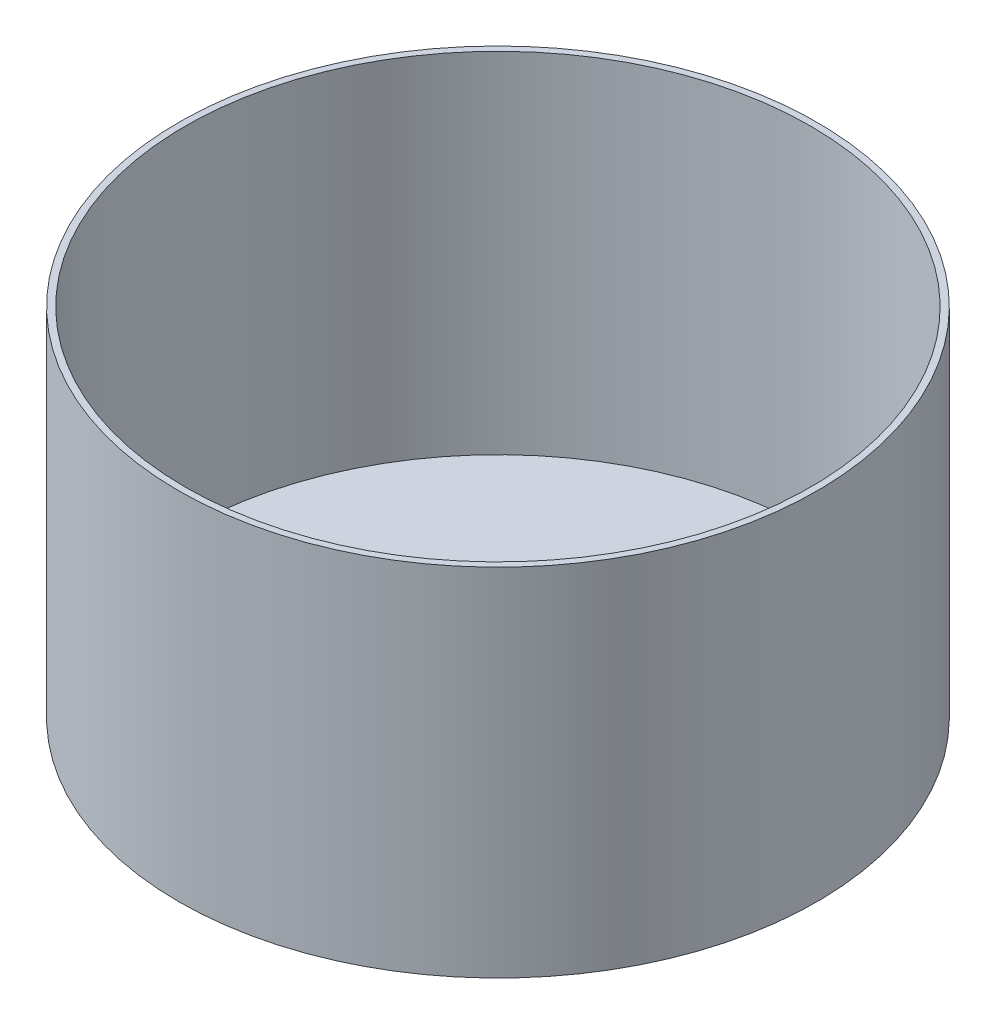
ISO-10303-21;
HEADER;
FILE_DESCRIPTION(('STEP AP214'),'2;1');
FILE_NAME('part.step','',(''),(''),'','','');
FILE_SCHEMA(('AUTOMOTIVE_DESIGN { 1 0 10303 214 1 1 1 1 }'));
ENDSEC;
DATA;
#1=APPLICATION_CONTEXT('core data for automotive mechanical design processes');
#2=APPLICATION_PROTOCOL_DEFINITION('international standard','automotive_design',2000,#1);
#3=PRODUCT_CONTEXT('',#1,'mechanical');
#4=PRODUCT('Part','Part','',(#3));
#5=PRODUCT_RELATED_PRODUCT_CATEGORY('part','',(#4));
#6=PRODUCT_DEFINITION_FORMATION('','',#4);
#7=PRODUCT_DEFINITION_CONTEXT('part definition',#1,'design');
#8=PRODUCT_DEFINITION('design','',#6,#7);
#9=PRODUCT_DEFINITION_SHAPE('','',#8);
#10=(LENGTH_UNIT() NAMED_UNIT(*) SI_UNIT(.MILLI.,.METRE.));
#11=(NAMED_UNIT(*) PLANE_ANGLE_UNIT() SI_UNIT($,.RADIAN.));
#12=(NAMED_UNIT(*) SI_UNIT($,.STERADIAN.) SOLID_ANGLE_UNIT());
#13=UNCERTAINTY_MEASURE_WITH_UNIT(LENGTH_MEASURE(1.E-05),#10,'distance_accuracy_value','');
#14=(GEOMETRIC_REPRESENTATION_CONTEXT(3) GLOBAL_UNCERTAINTY_ASSIGNED_CONTEXT((#13)) GLOBAL_UNIT_ASSIGNED_CONTEXT((#10,
#11,#12)) REPRESENTATION_CONTEXT('',''));
#15=CARTESIAN_POINT('',(0.,0.,0.));
#16=DIRECTION('',(0.,0.,1.));
#17=DIRECTION('',(1.,0.,0.));
#18=AXIS2_PLACEMENT_3D('',#15,#16,#17);
#19=CARTESIAN_POINT('',(0.,3.,0.));
#20=DIRECTION('',(0.,1.,0.));
#21=DIRECTION('',(0.,0.,1.));
#22=AXIS2_PLACEMENT_3D('',#19,#20,#21);
#23=PLANE('',#22);
#24=CARTESIAN_POINT('',(0.,3.,0.));
#25=DIRECTION('',(0.,1.,0.));
#26=DIRECTION('',(0.,0.,1.));
#27=AXIS2_PLACEMENT_3D('',#24,#25,#26);
#28=CIRCLE('',#27,65.);
#29=CARTESIAN_POINT('',(0.,3.,65.));
#30=VERTEX_POINT('',#29);
#31=EDGE_CURVE('E52',#30,#30,#28,.T.);
#32=ORIENTED_EDGE('',*,*,#31,.F.);
#33=EDGE_LOOP('',(#32));
#34=FACE_BOUND('',#33,.T.);
#35=CARTESIAN_POINT('',(0.,3.,0.));
#36=DIRECTION('',(0.,1.,0.));
#37=DIRECTION('',(0.,0.,1.));
#38=AXIS2_PLACEMENT_3D('',#35,#36,#37);
#39=CIRCLE('',#38,145.);
#40=CARTESIAN_POINT('',(0.,3.,145.));
#41=VERTEX_POINT('',#40);
#42=EDGE_CURVE('E10',#41,#41,#39,.F.);
#43=ORIENTED_EDGE('',*,*,#42,.F.);
#44=EDGE_LOOP('',(#43));
#45=FACE_BOUND('',#44,.T.);
#46=ADVANCED_FACE('F41',(#34,#45),#23,.T.);
#47=CARTESIAN_POINT('',(0.,0.,0.));
#48=DIRECTION('',(0.,1.,0.));
#49=DIRECTION('',(0.,0.,1.));
#50=AXIS2_PLACEMENT_3D('',#47,#48,#49);
#51=PLANE('',#50);
#52=CARTESIAN_POINT('',(0.,0.,0.));
#53=DIRECTION('',(0.,1.,0.));
#54=DIRECTION('',(0.,0.,1.));
#55=AXIS2_PLACEMENT_3D('',#52,#53,#54);
#56=CIRCLE('',#55,148.);
#57=CARTESIAN_POINT('',(0.,0.,148.));
#58=VERTEX_POINT('',#57);
#59=EDGE_CURVE('E44',#58,#58,#56,.T.);
#60=ORIENTED_EDGE('',*,*,#59,.F.);
#61=EDGE_LOOP('',(#60));
#62=FACE_BOUND('',#61,.T.);
#63=CARTESIAN_POINT('',(0.,0.,0.));
#64=DIRECTION('',(0.,1.,0.));
#65=DIRECTION('',(0.,0.,1.));
#66=AXIS2_PLACEMENT_3D('',#63,#64,#65);
#67=CIRCLE('',#66,65.);
#68=CARTESIAN_POINT('',(0.,0.,65.));
#69=VERTEX_POINT('',#68);
#70=EDGE_CURVE('E56',#69,#69,#67,.T.);
#71=ORIENTED_EDGE('',*,*,#70,.T.);
#72=EDGE_LOOP('',(#71));
#73=FACE_BOUND('',#72,.T.);
#74=ADVANCED_FACE('F84',(#62,#73),#51,.F.);
#75=CARTESIAN_POINT('',(0.,3.,0.));
#76=DIRECTION('',(0.,-1.,0.));
#77=DIRECTION('',(0.,0.,-1.));
#78=AXIS2_PLACEMENT_3D('',#75,#76,#77);
#79=CYLINDRICAL_SURFACE('',#78,148.);
#80=ORIENTED_EDGE('',*,*,#59,.T.);
#81=EDGE_LOOP('',(#80));
#82=FACE_BOUND('',#81,.T.);
#83=CARTESIAN_POINT('',(0.,165.,0.));
#84=DIRECTION('',(0.,1.,0.));
#85=DIRECTION('',(0.,0.,1.));
#86=AXIS2_PLACEMENT_3D('',#83,#84,#85);
#87=CIRCLE('',#86,148.);
#88=CARTESIAN_POINT('',(0.,165.,148.));
#89=VERTEX_POINT('',#88);
#90=EDGE_CURVE('E57',#89,#89,#87,.T.);
#91=ORIENTED_EDGE('',*,*,#90,.F.);
#92=EDGE_LOOP('',(#91));
#93=FACE_BOUND('',#92,.T.);
#94=ADVANCED_FACE('F43',(#82,#93),#79,.T.);
#95=CARTESIAN_POINT('',(0.,3.,0.));
#96=DIRECTION('',(0.,-1.,0.));
#97=DIRECTION('',(0.,0.,-1.));
#98=AXIS2_PLACEMENT_3D('',#95,#96,#97);
#99=CYLINDRICAL_SURFACE('',#98,65.);
#100=ORIENTED_EDGE('',*,*,#31,.T.);
#101=EDGE_LOOP('',(#100));
#102=FACE_BOUND('',#101,.T.);
#103=ORIENTED_EDGE('',*,*,#70,.F.);
#104=EDGE_LOOP('',(#103));
#105=FACE_BOUND('',#104,.T.);
#106=ADVANCED_FACE('F74',(#102,#105),#99,.F.);
#107=CARTESIAN_POINT('',(0.,165.,0.));
#108=DIRECTION('',(0.,1.,0.));
#109=DIRECTION('',(0.,0.,1.));
#110=AXIS2_PLACEMENT_3D('',#107,#108,#109);
#111=PLANE('',#110);
#112=ORIENTED_EDGE('',*,*,#90,.T.);
#113=EDGE_LOOP('',(#112));
#114=FACE_BOUND('',#113,.T.);
#115=CARTESIAN_POINT('',(0.,165.,0.));
#116=DIRECTION('',(0.,1.,0.));
#117=DIRECTION('',(0.,0.,1.));
#118=AXIS2_PLACEMENT_3D('',#115,#116,#117);
#119=CIRCLE('',#118,145.);
#120=CARTESIAN_POINT('',(0.,165.,145.));
#121=VERTEX_POINT('',#120);
#122=EDGE_CURVE('E61',#121,#121,#119,.T.);
#123=ORIENTED_EDGE('',*,*,#122,.F.);
#124=EDGE_LOOP('',(#123));
#125=FACE_BOUND('',#124,.T.);
#126=ADVANCED_FACE('F75',(#114,#125),#111,.T.);
#127=CARTESIAN_POINT('',(0.,165.,0.));
#128=DIRECTION('',(0.,-1.,0.));
#129=DIRECTION('',(0.,0.,-1.));
#130=AXIS2_PLACEMENT_3D('',#127,#128,#129);
#131=CYLINDRICAL_SURFACE('',#130,145.);
#132=ORIENTED_EDGE('',*,*,#42,.T.);
#133=EDGE_LOOP('',(#132));
#134=FACE_BOUND('',#133,.T.);
#135=ORIENTED_EDGE('',*,*,#122,.T.);
#136=EDGE_LOOP('',(#135));
#137=FACE_BOUND('',#136,.T.);
#138=ADVANCED_FACE('F69',(#134,#137),#131,.F.);
#139=CLOSED_SHELL('',(#46,#74,#94,#106,#126,#138));
#140=MANIFOLD_SOLID_BREP('B2',#139);
#141=ADVANCED_BREP_SHAPE_REPRESENTATION('',(#18,#140),#14);
#142=SHAPE_DEFINITION_REPRESENTATION(#9,#141);
ENDSEC;
END-ISO-10303-21;
